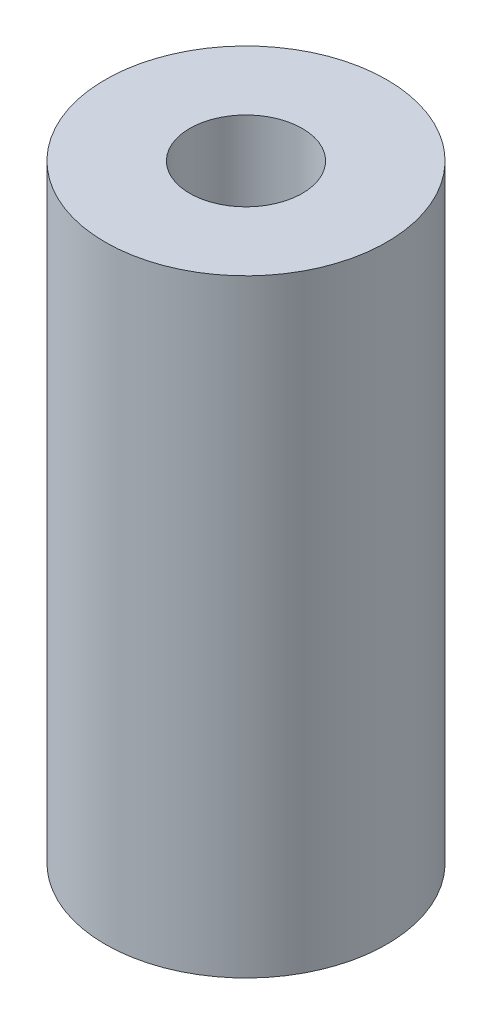
ISO-10303-21;
HEADER;
FILE_DESCRIPTION(('STEP AP214'),'2;1');
FILE_NAME('part.step','',(''),(''),'','','');
FILE_SCHEMA(('AUTOMOTIVE_DESIGN { 1 0 10303 214 1 1 1 1 }'));
ENDSEC;
DATA;
#1=APPLICATION_CONTEXT('core data for automotive mechanical design processes');
#2=APPLICATION_PROTOCOL_DEFINITION('international standard','automotive_design',2000,#1);
#3=PRODUCT_CONTEXT('',#1,'mechanical');
#4=PRODUCT('Part','Part','',(#3));
#5=PRODUCT_RELATED_PRODUCT_CATEGORY('part','',(#4));
#6=PRODUCT_DEFINITION_FORMATION('','',#4);
#7=PRODUCT_DEFINITION_CONTEXT('part definition',#1,'design');
#8=PRODUCT_DEFINITION('design','',#6,#7);
#9=PRODUCT_DEFINITION_SHAPE('','',#8);
#10=(LENGTH_UNIT() NAMED_UNIT(*) SI_UNIT(.MILLI.,.METRE.));
#11=(NAMED_UNIT(*) PLANE_ANGLE_UNIT() SI_UNIT($,.RADIAN.));
#12=(NAMED_UNIT(*) SI_UNIT($,.STERADIAN.) SOLID_ANGLE_UNIT());
#13=UNCERTAINTY_MEASURE_WITH_UNIT(LENGTH_MEASURE(1.E-05),#10,'distance_accuracy_value','');
#14=(GEOMETRIC_REPRESENTATION_CONTEXT(3) GLOBAL_UNCERTAINTY_ASSIGNED_CONTEXT((#13)) GLOBAL_UNIT_ASSIGNED_CONTEXT((#10,
#11,#12)) REPRESENTATION_CONTEXT('',''));
#15=CARTESIAN_POINT('',(0.,0.,0.));
#16=DIRECTION('',(0.,0.,1.));
#17=DIRECTION('',(1.,0.,0.));
#18=AXIS2_PLACEMENT_3D('',#15,#16,#17);
#19=CARTESIAN_POINT('',(0.,10.8,0.));
#20=DIRECTION('',(0.,1.,0.));
#21=DIRECTION('',(0.,0.,1.));
#22=AXIS2_PLACEMENT_3D('',#19,#20,#21);
#23=PLANE('',#22);
#24=CARTESIAN_POINT('',(0.,10.8,0.));
#25=DIRECTION('',(0.,1.,0.));
#26=DIRECTION('',(0.,0.,1.));
#27=AXIS2_PLACEMENT_3D('',#24,#25,#26);
#28=CIRCLE('',#27,2.5);
#29=CARTESIAN_POINT('',(0.,10.8,-2.5));
#30=VERTEX_POINT('',#29);
#31=EDGE_CURVE('E10',#30,#30,#28,.T.);
#32=ORIENTED_EDGE('',*,*,#31,.T.);
#33=EDGE_LOOP('',(#32));
#34=FACE_BOUND('',#33,.T.);
#35=CARTESIAN_POINT('',(0.,10.8,0.));
#36=DIRECTION('',(0.,1.,0.));
#37=DIRECTION('',(0.,0.,1.));
#38=AXIS2_PLACEMENT_3D('',#35,#36,#37);
#39=CIRCLE('',#38,1.);
#40=CARTESIAN_POINT('',(0.,10.8,-1.));
#41=VERTEX_POINT('',#40);
#42=EDGE_CURVE('E43',#41,#41,#39,.T.);
#43=ORIENTED_EDGE('',*,*,#42,.F.);
#44=EDGE_LOOP('',(#43));
#45=FACE_BOUND('',#44,.T.);
#46=ADVANCED_FACE('F32',(#34,#45),#23,.T.);
#47=CARTESIAN_POINT('',(0.,0.,0.));
#48=DIRECTION('',(0.,1.,0.));
#49=DIRECTION('',(0.,0.,1.));
#50=AXIS2_PLACEMENT_3D('',#47,#48,#49);
#51=PLANE('',#50);
#52=CARTESIAN_POINT('',(0.,0.,0.));
#53=DIRECTION('',(0.,1.,0.));
#54=DIRECTION('',(0.,0.,1.));
#55=AXIS2_PLACEMENT_3D('',#52,#53,#54);
#56=CIRCLE('',#55,2.5);
#57=CARTESIAN_POINT('',(0.,0.,-2.5));
#58=VERTEX_POINT('',#57);
#59=EDGE_CURVE('E36',#58,#58,#56,.T.);
#60=ORIENTED_EDGE('',*,*,#59,.F.);
#61=EDGE_LOOP('',(#60));
#62=FACE_BOUND('',#61,.T.);
#63=CARTESIAN_POINT('',(0.,0.,0.));
#64=DIRECTION('',(0.,1.,0.));
#65=DIRECTION('',(0.,0.,1.));
#66=AXIS2_PLACEMENT_3D('',#63,#64,#65);
#67=CIRCLE('',#66,1.);
#68=CARTESIAN_POINT('',(0.,0.,-1.));
#69=VERTEX_POINT('',#68);
#70=EDGE_CURVE('E45',#69,#69,#67,.T.);
#71=ORIENTED_EDGE('',*,*,#70,.T.);
#72=EDGE_LOOP('',(#71));
#73=FACE_BOUND('',#72,.T.);
#74=ADVANCED_FACE('F55',(#62,#73),#51,.F.);
#75=CARTESIAN_POINT('',(0.,10.8,0.));
#76=DIRECTION('',(0.,-1.,0.));
#77=DIRECTION('',(0.,0.,-1.));
#78=AXIS2_PLACEMENT_3D('',#75,#76,#77);
#79=CYLINDRICAL_SURFACE('',#78,2.5);
#80=CARTESIAN_POINT('',(0.,10.8,-2.5));
#81=CARTESIAN_POINT('',(0.,10.6875,-2.5));
#82=CARTESIAN_POINT('',(0.,10.575,-2.5));
#83=CARTESIAN_POINT('',(0.,10.35,-2.5));
#84=CARTESIAN_POINT('',(0.,10.2375,-2.5));
#85=CARTESIAN_POINT('',(0.,10.0125,-2.5));
#86=CARTESIAN_POINT('',(0.,9.9,-2.5));
#87=CARTESIAN_POINT('',(0.,9.675,-2.5));
#88=CARTESIAN_POINT('',(0.,9.5625,-2.5));
#89=CARTESIAN_POINT('',(0.,9.3375,-2.5));
#90=CARTESIAN_POINT('',(0.,9.225,-2.5));
#91=CARTESIAN_POINT('',(0.,9.,-2.5));
#92=CARTESIAN_POINT('',(0.,8.8875,-2.5));
#93=CARTESIAN_POINT('',(0.,8.6625,-2.5));
#94=CARTESIAN_POINT('',(0.,8.55,-2.5));
#95=CARTESIAN_POINT('',(0.,8.325,-2.5));
#96=CARTESIAN_POINT('',(0.,8.2125,-2.5));
#97=CARTESIAN_POINT('',(0.,7.9875,-2.5));
#98=CARTESIAN_POINT('',(0.,7.875,-2.5));
#99=CARTESIAN_POINT('',(0.,7.65,-2.5));
#100=CARTESIAN_POINT('',(0.,7.5375,-2.5));
#101=CARTESIAN_POINT('',(0.,7.3125,-2.5));
#102=CARTESIAN_POINT('',(0.,7.2,-2.5));
#103=CARTESIAN_POINT('',(0.,6.975,-2.5));
#104=CARTESIAN_POINT('',(0.,6.8625,-2.5));
#105=CARTESIAN_POINT('',(0.,6.6375,-2.5));
#106=CARTESIAN_POINT('',(0.,6.525,-2.5));
#107=CARTESIAN_POINT('',(0.,6.3,-2.5));
#108=CARTESIAN_POINT('',(0.,6.1875,-2.5));
#109=CARTESIAN_POINT('',(0.,5.9625,-2.5));
#110=CARTESIAN_POINT('',(0.,5.85,-2.5));
#111=CARTESIAN_POINT('',(0.,5.625,-2.5));
#112=CARTESIAN_POINT('',(0.,5.5125,-2.5));
#113=CARTESIAN_POINT('',(0.,5.2875,-2.5));
#114=CARTESIAN_POINT('',(0.,5.175,-2.5));
#115=CARTESIAN_POINT('',(0.,4.95,-2.5));
#116=CARTESIAN_POINT('',(0.,4.8375,-2.5));
#117=CARTESIAN_POINT('',(0.,4.6125,-2.5));
#118=CARTESIAN_POINT('',(0.,4.5,-2.5));
#119=CARTESIAN_POINT('',(0.,4.275,-2.5));
#120=CARTESIAN_POINT('',(0.,4.1625,-2.5));
#121=CARTESIAN_POINT('',(0.,3.9375,-2.5));
#122=CARTESIAN_POINT('',(0.,3.825,-2.5));
#123=CARTESIAN_POINT('',(0.,3.6,-2.5));
#124=CARTESIAN_POINT('',(0.,3.4875,-2.5));
#125=CARTESIAN_POINT('',(0.,3.2625,-2.5));
#126=CARTESIAN_POINT('',(0.,3.15,-2.5));
#127=CARTESIAN_POINT('',(0.,2.925,-2.5));
#128=CARTESIAN_POINT('',(0.,2.8125,-2.5));
#129=CARTESIAN_POINT('',(0.,2.5875,-2.5));
#130=CARTESIAN_POINT('',(0.,2.475,-2.5));
#131=CARTESIAN_POINT('',(0.,2.25,-2.5));
#132=CARTESIAN_POINT('',(0.,2.1375,-2.5));
#133=CARTESIAN_POINT('',(0.,1.9125,-2.5));
#134=CARTESIAN_POINT('',(0.,1.8,-2.5));
#135=CARTESIAN_POINT('',(0.,1.575,-2.5));
#136=CARTESIAN_POINT('',(0.,1.4625,-2.5));
#137=CARTESIAN_POINT('',(0.,1.2375,-2.5));
#138=CARTESIAN_POINT('',(0.,1.125,-2.5));
#139=CARTESIAN_POINT('',(0.,0.899999999999998,-2.5));
#140=CARTESIAN_POINT('',(0.,0.787499999999998,-2.5));
#141=CARTESIAN_POINT('',(0.,0.562499999999998,-2.5));
#142=CARTESIAN_POINT('',(0.,0.449999999999998,-2.5));
#143=CARTESIAN_POINT('',(0.,0.224999999999998,-2.5));
#144=CARTESIAN_POINT('',(0.,0.112499999999998,-2.5));
#145=CARTESIAN_POINT('',(0.,0.,-2.5));
#146=B_SPLINE_CURVE_WITH_KNOTS('',3,(#80,#81,#82,#83,#84,#85,#86,#87,#88,#89,#90,#91,#92,#93,
#94,#95,#96,#97,#98,#99,#100,#101,#102,#103,#104,#105,#106,#107,#108,#109,#110,#111,#112,#113,
#114,#115,#116,#117,#118,#119,#120,#121,#122,#123,#124,#125,#126,#127,#128,#129,#130,#131,#132,
#133,#134,#135,#136,#137,#138,#139,#140,#141,#142,#143,#144,#145),.UNSPECIFIED.,.F.,.F.,(4,2,2,
2,2,2,2,2,2,2,2,2,2,2,2,2,2,2,2,2,2,2,2,2,2,2,2,2,2,2,2,2,4),(0.,0.337499999999999,
0.674999999999998,1.0125,1.35,1.6875,2.025,2.3625,2.7,3.0375,3.375,3.7125,4.05,4.3875,4.725,
5.0625,5.4,5.7375,6.075,6.4125,6.75,7.0875,7.425,7.7625,8.1,8.4375,8.775,9.1125,9.45,9.7875,
10.125,10.4625,10.8),.UNSPECIFIED.);
#147=EDGE_CURVE('BSEAM34',#30,#58,#146,.T.);
#148=ORIENTED_EDGE('',*,*,#31,.F.);
#149=ORIENTED_EDGE('',*,*,#59,.T.);
#150=ORIENTED_EDGE('',*,*,#147,.T.);
#151=ORIENTED_EDGE('',*,*,#147,.F.);
#152=EDGE_LOOP('',(#148,#150,#149,#151));
#153=FACE_BOUND('',#152,.T.);
#154=ADVANCED_FACE('F34',(#153),#79,.T.);
#155=CARTESIAN_POINT('',(0.,10.8,0.));
#156=DIRECTION('',(0.,-1.,0.));
#157=DIRECTION('',(0.,0.,-1.));
#158=AXIS2_PLACEMENT_3D('',#155,#156,#157);
#159=CYLINDRICAL_SURFACE('',#158,1.);
#160=CARTESIAN_POINT('',(0.,10.8,-1.));
#161=CARTESIAN_POINT('',(0.,10.6875,-1.));
#162=CARTESIAN_POINT('',(0.,10.575,-1.));
#163=CARTESIAN_POINT('',(0.,10.35,-1.));
#164=CARTESIAN_POINT('',(0.,10.2375,-1.));
#165=CARTESIAN_POINT('',(0.,10.0125,-1.));
#166=CARTESIAN_POINT('',(0.,9.9,-1.));
#167=CARTESIAN_POINT('',(0.,9.675,-1.));
#168=CARTESIAN_POINT('',(0.,9.5625,-1.));
#169=CARTESIAN_POINT('',(0.,9.3375,-1.));
#170=CARTESIAN_POINT('',(0.,9.225,-1.));
#171=CARTESIAN_POINT('',(0.,9.,-1.));
#172=CARTESIAN_POINT('',(0.,8.8875,-1.));
#173=CARTESIAN_POINT('',(0.,8.6625,-1.));
#174=CARTESIAN_POINT('',(0.,8.55,-1.));
#175=CARTESIAN_POINT('',(0.,8.325,-1.));
#176=CARTESIAN_POINT('',(0.,8.2125,-1.));
#177=CARTESIAN_POINT('',(0.,7.9875,-1.));
#178=CARTESIAN_POINT('',(0.,7.875,-1.));
#179=CARTESIAN_POINT('',(0.,7.65,-1.));
#180=CARTESIAN_POINT('',(0.,7.5375,-1.));
#181=CARTESIAN_POINT('',(0.,7.3125,-1.));
#182=CARTESIAN_POINT('',(0.,7.2,-1.));
#183=CARTESIAN_POINT('',(0.,6.975,-1.));
#184=CARTESIAN_POINT('',(0.,6.8625,-1.));
#185=CARTESIAN_POINT('',(0.,6.6375,-1.));
#186=CARTESIAN_POINT('',(0.,6.525,-1.));
#187=CARTESIAN_POINT('',(0.,6.3,-1.));
#188=CARTESIAN_POINT('',(0.,6.1875,-1.));
#189=CARTESIAN_POINT('',(0.,5.9625,-1.));
#190=CARTESIAN_POINT('',(0.,5.85,-1.));
#191=CARTESIAN_POINT('',(0.,5.625,-1.));
#192=CARTESIAN_POINT('',(0.,5.5125,-1.));
#193=CARTESIAN_POINT('',(0.,5.2875,-1.));
#194=CARTESIAN_POINT('',(0.,5.175,-1.));
#195=CARTESIAN_POINT('',(0.,4.95,-1.));
#196=CARTESIAN_POINT('',(0.,4.8375,-1.));
#197=CARTESIAN_POINT('',(0.,4.6125,-1.));
#198=CARTESIAN_POINT('',(0.,4.5,-1.));
#199=CARTESIAN_POINT('',(0.,4.275,-1.));
#200=CARTESIAN_POINT('',(0.,4.1625,-1.));
#201=CARTESIAN_POINT('',(0.,3.9375,-1.));
#202=CARTESIAN_POINT('',(0.,3.825,-1.));
#203=CARTESIAN_POINT('',(0.,3.6,-1.));
#204=CARTESIAN_POINT('',(0.,3.4875,-1.));
#205=CARTESIAN_POINT('',(0.,3.2625,-1.));
#206=CARTESIAN_POINT('',(0.,3.15,-1.));
#207=CARTESIAN_POINT('',(0.,2.925,-1.));
#208=CARTESIAN_POINT('',(0.,2.8125,-1.));
#209=CARTESIAN_POINT('',(0.,2.5875,-1.));
#210=CARTESIAN_POINT('',(0.,2.475,-1.));
#211=CARTESIAN_POINT('',(0.,2.25,-1.));
#212=CARTESIAN_POINT('',(0.,2.1375,-1.));
#213=CARTESIAN_POINT('',(0.,1.9125,-1.));
#214=CARTESIAN_POINT('',(0.,1.8,-1.));
#215=CARTESIAN_POINT('',(0.,1.575,-1.));
#216=CARTESIAN_POINT('',(0.,1.4625,-1.));
#217=CARTESIAN_POINT('',(0.,1.2375,-1.));
#218=CARTESIAN_POINT('',(0.,1.125,-1.));
#219=CARTESIAN_POINT('',(0.,0.899999999999998,-1.));
#220=CARTESIAN_POINT('',(0.,0.787499999999998,-1.));
#221=CARTESIAN_POINT('',(0.,0.562499999999999,-1.));
#222=CARTESIAN_POINT('',(0.,0.449999999999999,-1.));
#223=CARTESIAN_POINT('',(0.,0.224999999999999,-1.));
#224=CARTESIAN_POINT('',(0.,0.112499999999998,-1.));
#225=CARTESIAN_POINT('',(0.,0.,-1.));
#226=B_SPLINE_CURVE_WITH_KNOTS('',3,(#160,#161,#162,#163,#164,#165,#166,#167,#168,#169,#170,
#171,#172,#173,#174,#175,#176,#177,#178,#179,#180,#181,#182,#183,#184,#185,#186,#187,#188,#189,
#190,#191,#192,#193,#194,#195,#196,#197,#198,#199,#200,#201,#202,#203,#204,#205,#206,#207,#208,
#209,#210,#211,#212,#213,#214,#215,#216,#217,#218,#219,#220,#221,#222,#223,#224,#225),
.UNSPECIFIED.,.F.,.F.,(4,2,2,2,2,2,2,2,2,2,2,2,2,2,2,2,2,2,2,2,2,2,2,2,2,2,2,2,2,2,2,2,4),(0.,
0.337500000000001,0.675,1.0125,1.35,1.6875,2.025,2.3625,2.7,3.0375,3.375,3.7125,4.05,4.3875,
4.725,5.0625,5.4,5.7375,6.075,6.4125,6.75,7.0875,7.425,7.7625,8.1,8.4375,8.775,9.1125,9.45,
9.7875,10.125,10.4625,10.8),.UNSPECIFIED.);
#227=EDGE_CURVE('BSEAM51',#41,#69,#226,.T.);
#228=ORIENTED_EDGE('',*,*,#42,.T.);
#229=ORIENTED_EDGE('',*,*,#70,.F.);
#230=ORIENTED_EDGE('',*,*,#227,.T.);
#231=ORIENTED_EDGE('',*,*,#227,.F.);
#232=EDGE_LOOP('',(#228,#230,#229,#231));
#233=FACE_BOUND('',#232,.T.);
#234=ADVANCED_FACE('F51',(#233),#159,.F.);
#235=CLOSED_SHELL('',(#46,#74,#154,#234));
#236=MANIFOLD_SOLID_BREP('B2',#235);
#237=ADVANCED_BREP_SHAPE_REPRESENTATION('',(#18,#236),#14);
#238=SHAPE_DEFINITION_REPRESENTATION(#9,#237);
ENDSEC;
END-ISO-10303-21;
